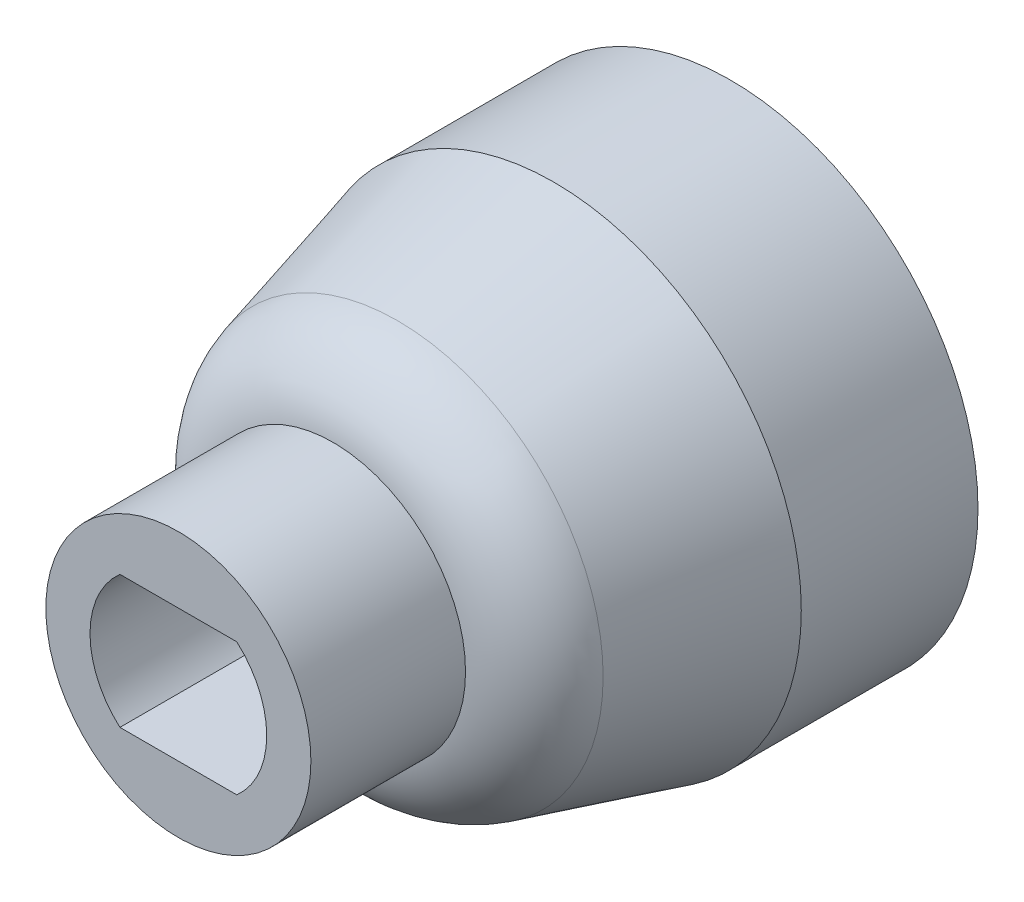
ISO-10303-21;
HEADER;
FILE_DESCRIPTION(('STEP AP214'),'2;1');
FILE_NAME('part.step','',(''),(''),'','','');
FILE_SCHEMA(('AUTOMOTIVE_DESIGN { 1 0 10303 214 1 1 1 1 }'));
ENDSEC;
DATA;
#1=APPLICATION_CONTEXT('core data for automotive mechanical design processes');
#2=APPLICATION_PROTOCOL_DEFINITION('international standard','automotive_design',2000,#1);
#3=PRODUCT_CONTEXT('',#1,'mechanical');
#4=PRODUCT('Part','Part','',(#3));
#5=PRODUCT_RELATED_PRODUCT_CATEGORY('part','',(#4));
#6=PRODUCT_DEFINITION_FORMATION('','',#4);
#7=PRODUCT_DEFINITION_CONTEXT('part definition',#1,'design');
#8=PRODUCT_DEFINITION('design','',#6,#7);
#9=PRODUCT_DEFINITION_SHAPE('','',#8);
#10=(LENGTH_UNIT() NAMED_UNIT(*) SI_UNIT(.MILLI.,.METRE.));
#11=(NAMED_UNIT(*) PLANE_ANGLE_UNIT() SI_UNIT($,.RADIAN.));
#12=(NAMED_UNIT(*) SI_UNIT($,.STERADIAN.) SOLID_ANGLE_UNIT());
#13=UNCERTAINTY_MEASURE_WITH_UNIT(LENGTH_MEASURE(1.E-05),#10,'distance_accuracy_value','');
#14=(GEOMETRIC_REPRESENTATION_CONTEXT(3) GLOBAL_UNCERTAINTY_ASSIGNED_CONTEXT((#13)) GLOBAL_UNIT_ASSIGNED_CONTEXT((#10,
#11,#12)) REPRESENTATION_CONTEXT('',''));
#15=CARTESIAN_POINT('',(0.,0.,0.));
#16=DIRECTION('',(0.,0.,1.));
#17=DIRECTION('',(1.,0.,0.));
#18=AXIS2_PLACEMENT_3D('',#15,#16,#17);
#19=CARTESIAN_POINT('',(0.,0.,9.));
#20=DIRECTION('',(0.,0.,-1.));
#21=DIRECTION('',(-1.,0.,0.));
#22=AXIS2_PLACEMENT_3D('',#19,#20,#21);
#23=CYLINDRICAL_SURFACE('',#22,5.6);
#24=CARTESIAN_POINT('',(0.,0.,3.99999999999995));
#25=DIRECTION('',(0.,0.,1.));
#26=DIRECTION('',(1.,0.,0.));
#27=AXIS2_PLACEMENT_3D('',#24,#25,#26);
#28=CIRCLE('',#27,5.6);
#29=CARTESIAN_POINT('',(5.6,0.,3.99999999999995));
#30=VERTEX_POINT('',#29);
#31=EDGE_CURVE('E48',#30,#30,#28,.F.);
#32=ORIENTED_EDGE('',*,*,#31,.T.);
#33=EDGE_LOOP('',(#32));
#34=FACE_BOUND('',#33,.T.);
#35=CARTESIAN_POINT('',(0.,0.,0.));
#36=DIRECTION('',(0.,0.,1.));
#37=DIRECTION('',(1.,0.,0.));
#38=AXIS2_PLACEMENT_3D('',#35,#36,#37);
#39=CIRCLE('',#38,5.6);
#40=CARTESIAN_POINT('',(5.6,0.,0.));
#41=VERTEX_POINT('',#40);
#42=EDGE_CURVE('E133',#41,#41,#39,.T.);
#43=ORIENTED_EDGE('',*,*,#42,.T.);
#44=EDGE_LOOP('',(#43));
#45=FACE_BOUND('',#44,.T.);
#46=ADVANCED_FACE('F39',(#34,#45),#23,.T.);
#47=CARTESIAN_POINT('',(0.,0.,0.));
#48=DIRECTION('',(0.,0.,1.));
#49=DIRECTION('',(1.,0.,0.));
#50=AXIS2_PLACEMENT_3D('',#47,#48,#49);
#51=PLANE('',#50);
#52=ORIENTED_EDGE('',*,*,#42,.F.);
#53=EDGE_LOOP('',(#52));
#54=FACE_BOUND('',#53,.T.);
#55=ADVANCED_FACE('F158',(#54),#51,.F.);
#56=CARTESIAN_POINT('',(0.,0.,12.5));
#57=DIRECTION('',(0.,0.,1.));
#58=DIRECTION('',(1.,0.,0.));
#59=AXIS2_PLACEMENT_3D('',#56,#57,#58);
#60=PLANE('',#59);
#61=CARTESIAN_POINT('',(0.,0.,12.5));
#62=DIRECTION('',(0.,0.,1.));
#63=DIRECTION('',(1.,0.,0.));
#64=AXIS2_PLACEMENT_3D('',#61,#62,#63);
#65=CIRCLE('',#64,3.);
#66=CARTESIAN_POINT('',(3.,0.,12.5));
#67=VERTEX_POINT('',#66);
#68=EDGE_CURVE('E129',#67,#67,#65,.T.);
#69=ORIENTED_EDGE('',*,*,#68,.T.);
#70=EDGE_LOOP('',(#69));
#71=FACE_BOUND('',#70,.T.);
#72=DIRECTION('',(-1.,0.,0.));
#73=VECTOR('',#72,1.);
#74=CARTESIAN_POINT('',(-1.3228756555323,1.5,12.5));
#75=LINE('',#74,#73);
#76=CARTESIAN_POINT('',(1.3228756555323,1.5,12.5));
#77=VERTEX_POINT('',#76);
#78=CARTESIAN_POINT('',(-1.3228756555323,1.5,12.5));
#79=VERTEX_POINT('',#78);
#80=EDGE_CURVE('E90',#77,#79,#75,.T.);
#81=ORIENTED_EDGE('',*,*,#80,.F.);
#82=CARTESIAN_POINT('',(0.,0.,12.5));
#83=DIRECTION('',(0.,0.,1.));
#84=DIRECTION('',(1.,0.,0.));
#85=AXIS2_PLACEMENT_3D('',#82,#83,#84);
#86=CIRCLE('',#85,2.);
#87=CARTESIAN_POINT('',(1.3228756555323,-1.5,12.5));
#88=VERTEX_POINT('',#87);
#89=EDGE_CURVE('E80',#88,#77,#86,.T.);
#90=ORIENTED_EDGE('',*,*,#89,.F.);
#91=DIRECTION('',(1.,0.,0.));
#92=VECTOR('',#91,1.);
#93=CARTESIAN_POINT('',(-1.3228756555323,-1.5,12.5));
#94=LINE('',#93,#92);
#95=CARTESIAN_POINT('',(-1.3228756555323,-1.5,12.5));
#96=VERTEX_POINT('',#95);
#97=EDGE_CURVE('E107',#96,#88,#94,.T.);
#98=ORIENTED_EDGE('',*,*,#97,.F.);
#99=CARTESIAN_POINT('',(0.,0.,12.5));
#100=DIRECTION('',(0.,0.,1.));
#101=DIRECTION('',(1.,0.,0.));
#102=AXIS2_PLACEMENT_3D('',#99,#100,#101);
#103=CIRCLE('',#102,2.);
#104=EDGE_CURVE('E103',#79,#96,#103,.T.);
#105=ORIENTED_EDGE('',*,*,#104,.F.);
#106=EDGE_LOOP('',(#81,#90,#98,#105));
#107=FACE_BOUND('',#106,.T.);
#108=ADVANCED_FACE('F101',(#71,#107),#60,.T.);
#109=CARTESIAN_POINT('',(0.,0.,12.5));
#110=DIRECTION('',(0.,0.,-1.));
#111=DIRECTION('',(-1.,0.,0.));
#112=AXIS2_PLACEMENT_3D('',#109,#110,#111);
#113=CYLINDRICAL_SURFACE('',#112,3.);
#114=ORIENTED_EDGE('',*,*,#68,.F.);
#115=EDGE_LOOP('',(#114));
#116=FACE_BOUND('',#115,.T.);
#117=CARTESIAN_POINT('',(0.,0.,9.));
#118=DIRECTION('',(0.,0.,1.));
#119=DIRECTION('',(1.,0.,0.));
#120=AXIS2_PLACEMENT_3D('',#117,#118,#119);
#121=CIRCLE('',#120,3.);
#122=CARTESIAN_POINT('',(3.,0.,9.));
#123=VERTEX_POINT('',#122);
#124=EDGE_CURVE('E97',#123,#123,#121,.T.);
#125=ORIENTED_EDGE('',*,*,#124,.T.);
#126=EDGE_LOOP('',(#125));
#127=FACE_BOUND('',#126,.T.);
#128=ADVANCED_FACE('F165',(#116,#127),#113,.T.);
#129=CARTESIAN_POINT('',(0.,0.,12.5));
#130=DIRECTION('',(0.,0.,-1.));
#131=DIRECTION('',(-1.,0.,0.));
#132=AXIS2_PLACEMENT_3D('',#129,#130,#131);
#133=CYLINDRICAL_SURFACE('',#132,2.);
#134=CARTESIAN_POINT('',(0.,0.,9.));
#135=DIRECTION('',(0.,0.,1.));
#136=DIRECTION('',(1.,0.,0.));
#137=AXIS2_PLACEMENT_3D('',#134,#135,#136);
#138=CIRCLE('',#137,2.);
#139=CARTESIAN_POINT('',(1.3228756555323,-1.5,9.));
#140=VERTEX_POINT('',#139);
#141=CARTESIAN_POINT('',(1.3228756555323,1.5,9.));
#142=VERTEX_POINT('',#141);
#143=EDGE_CURVE('E55',#140,#142,#138,.T.);
#144=ORIENTED_EDGE('',*,*,#143,.F.);
#145=DIRECTION('',(0.,0.,-1.));
#146=VECTOR('',#145,1.);
#147=CARTESIAN_POINT('',(1.3228756555323,-1.5,12.5));
#148=LINE('',#147,#146);
#149=EDGE_CURVE('E85',#88,#140,#148,.T.);
#150=ORIENTED_EDGE('',*,*,#149,.F.);
#151=ORIENTED_EDGE('',*,*,#89,.T.);
#152=DIRECTION('',(0.,0.,-1.));
#153=VECTOR('',#152,1.);
#154=CARTESIAN_POINT('',(1.3228756555323,1.5,12.5));
#155=LINE('',#154,#153);
#156=EDGE_CURVE('E83',#77,#142,#155,.T.);
#157=ORIENTED_EDGE('',*,*,#156,.T.);
#158=EDGE_LOOP('',(#144,#150,#151,#157));
#159=FACE_BOUND('',#158,.T.);
#160=ADVANCED_FACE('F82',(#159),#133,.F.);
#161=CARTESIAN_POINT('',(-1.3228756555323,1.5,12.5));
#162=DIRECTION('',(0.,-1.,0.));
#163=DIRECTION('',(0.,0.,-1.));
#164=AXIS2_PLACEMENT_3D('',#161,#162,#163);
#165=PLANE('',#164);
#166=DIRECTION('',(-1.,0.,0.));
#167=VECTOR('',#166,1.);
#168=CARTESIAN_POINT('',(-1.3228756555323,1.5,9.));
#169=LINE('',#168,#167);
#170=CARTESIAN_POINT('',(-1.3228756555323,1.5,9.));
#171=VERTEX_POINT('',#170);
#172=EDGE_CURVE('E59',#142,#171,#169,.T.);
#173=ORIENTED_EDGE('',*,*,#172,.F.);
#174=ORIENTED_EDGE('',*,*,#156,.F.);
#175=ORIENTED_EDGE('',*,*,#80,.T.);
#176=DIRECTION('',(0.,0.,-1.));
#177=VECTOR('',#176,1.);
#178=CARTESIAN_POINT('',(-1.3228756555323,1.5,12.5));
#179=LINE('',#178,#177);
#180=EDGE_CURVE('E98',#79,#171,#179,.T.);
#181=ORIENTED_EDGE('',*,*,#180,.T.);
#182=EDGE_LOOP('',(#173,#174,#175,#181));
#183=FACE_BOUND('',#182,.T.);
#184=ADVANCED_FACE('F94',(#183),#165,.T.);
#185=CARTESIAN_POINT('',(0.,0.,12.5));
#186=DIRECTION('',(0.,0.,-1.));
#187=DIRECTION('',(-1.,0.,0.));
#188=AXIS2_PLACEMENT_3D('',#185,#186,#187);
#189=CYLINDRICAL_SURFACE('',#188,2.);
#190=CARTESIAN_POINT('',(0.,0.,9.));
#191=DIRECTION('',(0.,0.,1.));
#192=DIRECTION('',(1.,0.,0.));
#193=AXIS2_PLACEMENT_3D('',#190,#191,#192);
#194=CIRCLE('',#193,2.);
#195=CARTESIAN_POINT('',(-1.3228756555323,-1.5,9.));
#196=VERTEX_POINT('',#195);
#197=EDGE_CURVE('E116',#171,#196,#194,.T.);
#198=ORIENTED_EDGE('',*,*,#197,.F.);
#199=ORIENTED_EDGE('',*,*,#180,.F.);
#200=ORIENTED_EDGE('',*,*,#104,.T.);
#201=DIRECTION('',(0.,0.,-1.));
#202=VECTOR('',#201,1.);
#203=CARTESIAN_POINT('',(-1.3228756555323,-1.5,12.5));
#204=LINE('',#203,#202);
#205=EDGE_CURVE('E123',#96,#196,#204,.T.);
#206=ORIENTED_EDGE('',*,*,#205,.T.);
#207=EDGE_LOOP('',(#198,#199,#200,#206));
#208=FACE_BOUND('',#207,.T.);
#209=ADVANCED_FACE('F176',(#208),#189,.F.);
#210=CARTESIAN_POINT('',(-1.3228756555323,-1.5,12.5));
#211=DIRECTION('',(0.,1.,0.));
#212=DIRECTION('',(0.,0.,1.));
#213=AXIS2_PLACEMENT_3D('',#210,#211,#212);
#214=PLANE('',#213);
#215=DIRECTION('',(1.,0.,0.));
#216=VECTOR('',#215,1.);
#217=CARTESIAN_POINT('',(-1.3228756555323,-1.5,9.));
#218=LINE('',#217,#216);
#219=EDGE_CURVE('E91',#196,#140,#218,.T.);
#220=ORIENTED_EDGE('',*,*,#219,.F.);
#221=ORIENTED_EDGE('',*,*,#205,.F.);
#222=ORIENTED_EDGE('',*,*,#97,.T.);
#223=ORIENTED_EDGE('',*,*,#149,.T.);
#224=EDGE_LOOP('',(#220,#221,#222,#223));
#225=FACE_BOUND('',#224,.T.);
#226=ADVANCED_FACE('F154',(#225),#214,.T.);
#227=CARTESIAN_POINT('',(0.,0.,9.));
#228=DIRECTION('',(0.,0.,1.));
#229=DIRECTION('',(1.,0.,0.));
#230=AXIS2_PLACEMENT_3D('',#227,#228,#229);
#231=PLANE('',#230);
#232=ORIENTED_EDGE('',*,*,#143,.T.);
#233=ORIENTED_EDGE('',*,*,#172,.T.);
#234=ORIENTED_EDGE('',*,*,#197,.T.);
#235=ORIENTED_EDGE('',*,*,#219,.T.);
#236=EDGE_LOOP('',(#232,#233,#234,#235));
#237=FACE_BOUND('',#236,.T.);
#238=ADVANCED_FACE('F147',(#237),#231,.T.);
#239=CARTESIAN_POINT('',(0.,0.,9.));
#240=DIRECTION('',(0.,0.,-1.));
#241=DIRECTION('',(-1.,0.,0.));
#242=AXIS2_PLACEMENT_3D('',#239,#240,#241);
#243=CONICAL_SURFACE('',#242,4.26025403784439,0.261799387799147);
#244=CARTESIAN_POINT('',(0.,0.,7.53728775245391));
#245=DIRECTION('',(0.,0.,-1.));
#246=DIRECTION('',(-1.,0.,0.));
#247=AXIS2_PLACEMENT_3D('',#244,#245,#246);
#248=CIRCLE('',#247,4.65218660333347);
#249=CARTESIAN_POINT('',(-4.65218660333347,0.,7.53728775245391));
#250=VERTEX_POINT('',#249);
#251=EDGE_CURVE('E11',#250,#250,#248,.T.);
#252=ORIENTED_EDGE('',*,*,#251,.T.);
#253=EDGE_LOOP('',(#252));
#254=FACE_BOUND('',#253,.T.);
#255=ORIENTED_EDGE('',*,*,#31,.F.);
#256=EDGE_LOOP('',(#255));
#257=FACE_BOUND('',#256,.T.);
#258=ADVANCED_FACE('F145',(#254,#257),#243,.T.);
#259=CARTESIAN_POINT('',(0.,0.,7.01964966224887));
#260=DIRECTION('',(0.,0.,1.));
#261=DIRECTION('',(1.,0.,0.));
#262=AXIS2_PLACEMENT_3D('',#259,#260,#261);
#263=TOROIDAL_SURFACE('',#262,2.72033495075533,2.);
#264=ORIENTED_EDGE('',*,*,#251,.F.);
#265=EDGE_LOOP('',(#264));
#266=FACE_BOUND('',#265,.T.);
#267=ORIENTED_EDGE('',*,*,#124,.F.);
#268=EDGE_LOOP('',(#267));
#269=FACE_BOUND('',#268,.T.);
#270=ADVANCED_FACE('F41',(#266,#269),#263,.T.);
#271=CLOSED_SHELL('',(#46,#55,#108,#128,#160,#184,#209,#226,#238,#258,#270));
#272=MANIFOLD_SOLID_BREP('B2',#271);
#273=ADVANCED_BREP_SHAPE_REPRESENTATION('',(#18,#272),#14);
#274=SHAPE_DEFINITION_REPRESENTATION(#9,#273);
ENDSEC;
END-ISO-10303-21;
